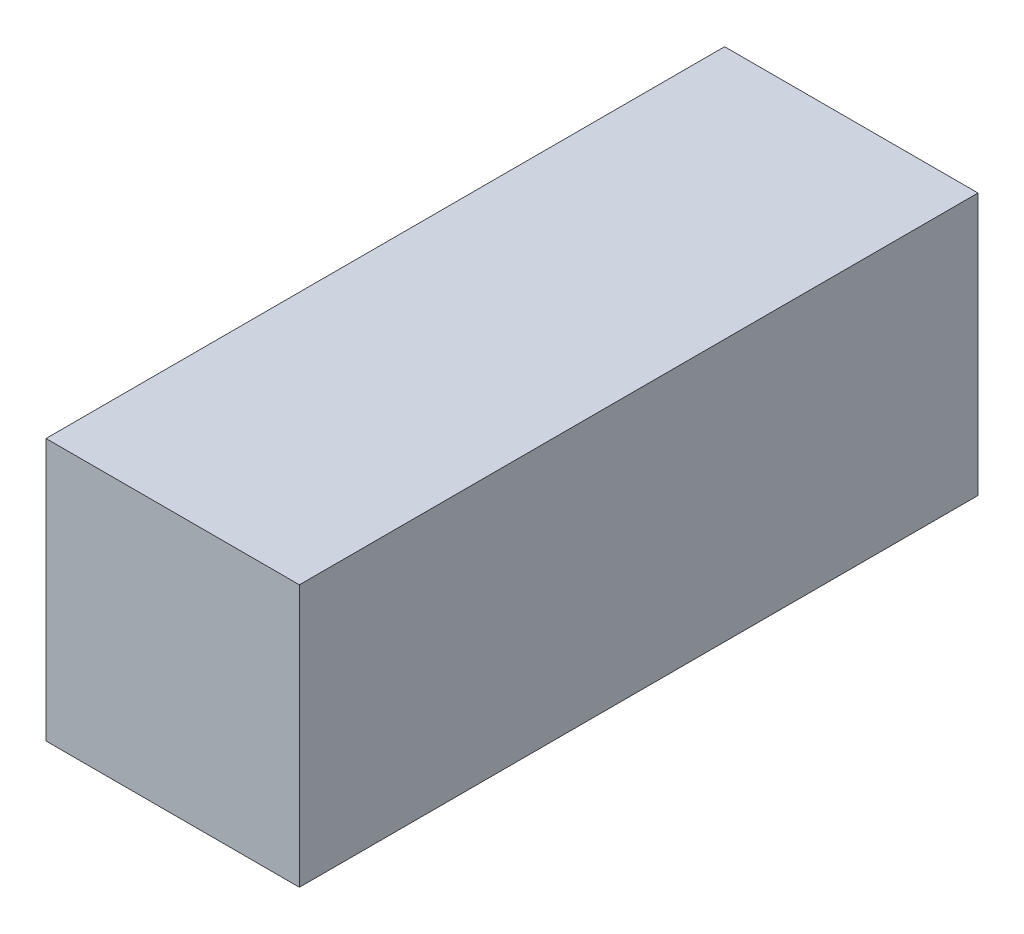
ISO-10303-21;
HEADER;
FILE_DESCRIPTION(('STEP AP214'),'2;1');
FILE_NAME('part.step','',(''),(''),'','','');
FILE_SCHEMA(('AUTOMOTIVE_DESIGN { 1 0 10303 214 1 1 1 1 }'));
ENDSEC;
DATA;
#1=APPLICATION_CONTEXT('core data for automotive mechanical design processes');
#2=APPLICATION_PROTOCOL_DEFINITION('international standard','automotive_design',2000,#1);
#3=PRODUCT_CONTEXT('',#1,'mechanical');
#4=PRODUCT('Part','Part','',(#3));
#5=PRODUCT_RELATED_PRODUCT_CATEGORY('part','',(#4));
#6=PRODUCT_DEFINITION_FORMATION('','',#4);
#7=PRODUCT_DEFINITION_CONTEXT('part definition',#1,'design');
#8=PRODUCT_DEFINITION('design','',#6,#7);
#9=PRODUCT_DEFINITION_SHAPE('','',#8);
#10=(LENGTH_UNIT() NAMED_UNIT(*) SI_UNIT(.MILLI.,.METRE.));
#11=(NAMED_UNIT(*) PLANE_ANGLE_UNIT() SI_UNIT($,.RADIAN.));
#12=(NAMED_UNIT(*) SI_UNIT($,.STERADIAN.) SOLID_ANGLE_UNIT());
#13=UNCERTAINTY_MEASURE_WITH_UNIT(LENGTH_MEASURE(1.E-05),#10,'distance_accuracy_value','');
#14=(GEOMETRIC_REPRESENTATION_CONTEXT(3) GLOBAL_UNCERTAINTY_ASSIGNED_CONTEXT((#13)) GLOBAL_UNIT_ASSIGNED_CONTEXT((#10,
#11,#12)) REPRESENTATION_CONTEXT('',''));
#15=CARTESIAN_POINT('',(0.,0.,0.));
#16=DIRECTION('',(0.,0.,1.));
#17=DIRECTION('',(1.,0.,0.));
#18=AXIS2_PLACEMENT_3D('',#15,#16,#17);
#19=CARTESIAN_POINT('',(-29.5,61.,79.));
#20=DIRECTION('',(1.,0.,0.));
#21=DIRECTION('',(0.,0.,-1.));
#22=AXIS2_PLACEMENT_3D('',#19,#20,#21);
#23=PLANE('',#22);
#24=DIRECTION('',(0.,0.,1.));
#25=VECTOR('',#24,1.);
#26=CARTESIAN_POINT('',(-29.5,0.,79.));
#27=LINE('',#26,#25);
#28=CARTESIAN_POINT('',(-29.5,0.,-79.));
#29=VERTEX_POINT('',#28);
#30=CARTESIAN_POINT('',(-29.5,0.,79.));
#31=VERTEX_POINT('',#30);
#32=EDGE_CURVE('E97',#29,#31,#27,.T.);
#33=ORIENTED_EDGE('',*,*,#32,.T.);
#34=DIRECTION('',(0.,-1.,0.));
#35=VECTOR('',#34,1.);
#36=CARTESIAN_POINT('',(-29.5,61.,79.));
#37=LINE('',#36,#35);
#38=CARTESIAN_POINT('',(-29.5,61.,79.));
#39=VERTEX_POINT('',#38);
#40=EDGE_CURVE('E11',#39,#31,#37,.T.);
#41=ORIENTED_EDGE('',*,*,#40,.F.);
#42=DIRECTION('',(0.,0.,1.));
#43=VECTOR('',#42,1.);
#44=CARTESIAN_POINT('',(-29.5,61.,79.));
#45=LINE('',#44,#43);
#46=CARTESIAN_POINT('',(-29.5,61.,-79.));
#47=VERTEX_POINT('',#46);
#48=EDGE_CURVE('E85',#47,#39,#45,.T.);
#49=ORIENTED_EDGE('',*,*,#48,.F.);
#50=DIRECTION('',(0.,-1.,0.));
#51=VECTOR('',#50,1.);
#52=CARTESIAN_POINT('',(-29.5,61.,-79.));
#53=LINE('',#52,#51);
#54=EDGE_CURVE('E93',#47,#29,#53,.T.);
#55=ORIENTED_EDGE('',*,*,#54,.T.);
#56=EDGE_LOOP('',(#33,#41,#49,#55));
#57=FACE_BOUND('',#56,.T.);
#58=ADVANCED_FACE('F34',(#57),#23,.F.);
#59=CARTESIAN_POINT('',(-29.5,61.,79.));
#60=DIRECTION('',(0.,0.,-1.));
#61=DIRECTION('',(-1.,0.,0.));
#62=AXIS2_PLACEMENT_3D('',#59,#60,#61);
#63=PLANE('',#62);
#64=DIRECTION('',(1.,0.,0.));
#65=VECTOR('',#64,1.);
#66=CARTESIAN_POINT('',(-29.5,0.,79.));
#67=LINE('',#66,#65);
#68=CARTESIAN_POINT('',(29.5,0.,79.));
#69=VERTEX_POINT('',#68);
#70=EDGE_CURVE('E89',#31,#69,#67,.T.);
#71=ORIENTED_EDGE('',*,*,#70,.T.);
#72=DIRECTION('',(0.,-1.,0.));
#73=VECTOR('',#72,1.);
#74=CARTESIAN_POINT('',(29.5,61.,79.));
#75=LINE('',#74,#73);
#76=CARTESIAN_POINT('',(29.5,61.,79.));
#77=VERTEX_POINT('',#76);
#78=EDGE_CURVE('E42',#77,#69,#75,.T.);
#79=ORIENTED_EDGE('',*,*,#78,.F.);
#80=DIRECTION('',(1.,0.,0.));
#81=VECTOR('',#80,1.);
#82=CARTESIAN_POINT('',(-29.5,61.,79.));
#83=LINE('',#82,#81);
#84=EDGE_CURVE('E80',#39,#77,#83,.T.);
#85=ORIENTED_EDGE('',*,*,#84,.F.);
#86=ORIENTED_EDGE('',*,*,#40,.T.);
#87=EDGE_LOOP('',(#71,#79,#85,#86));
#88=FACE_BOUND('',#87,.T.);
#89=ADVANCED_FACE('F88',(#88),#63,.F.);
#90=CARTESIAN_POINT('',(29.5,61.,79.));
#91=DIRECTION('',(-1.,0.,0.));
#92=DIRECTION('',(0.,0.,1.));
#93=AXIS2_PLACEMENT_3D('',#90,#91,#92);
#94=PLANE('',#93);
#95=DIRECTION('',(0.,0.,-1.));
#96=VECTOR('',#95,1.);
#97=CARTESIAN_POINT('',(29.5,0.,79.));
#98=LINE('',#97,#96);
#99=CARTESIAN_POINT('',(29.5,0.,-79.));
#100=VERTEX_POINT('',#99);
#101=EDGE_CURVE('E67',#69,#100,#98,.T.);
#102=ORIENTED_EDGE('',*,*,#101,.T.);
#103=DIRECTION('',(0.,-1.,0.));
#104=VECTOR('',#103,1.);
#105=CARTESIAN_POINT('',(29.5,61.,-79.));
#106=LINE('',#105,#104);
#107=CARTESIAN_POINT('',(29.5,61.,-79.));
#108=VERTEX_POINT('',#107);
#109=EDGE_CURVE('E90',#108,#100,#106,.T.);
#110=ORIENTED_EDGE('',*,*,#109,.F.);
#111=DIRECTION('',(0.,0.,-1.));
#112=VECTOR('',#111,1.);
#113=CARTESIAN_POINT('',(29.5,61.,79.));
#114=LINE('',#113,#112);
#115=EDGE_CURVE('E83',#77,#108,#114,.T.);
#116=ORIENTED_EDGE('',*,*,#115,.F.);
#117=ORIENTED_EDGE('',*,*,#78,.T.);
#118=EDGE_LOOP('',(#102,#110,#116,#117));
#119=FACE_BOUND('',#118,.T.);
#120=ADVANCED_FACE('F91',(#119),#94,.F.);
#121=CARTESIAN_POINT('',(-29.5,61.,-79.));
#122=DIRECTION('',(0.,0.,1.));
#123=DIRECTION('',(1.,0.,0.));
#124=AXIS2_PLACEMENT_3D('',#121,#122,#123);
#125=PLANE('',#124);
#126=DIRECTION('',(-1.,0.,0.));
#127=VECTOR('',#126,1.);
#128=CARTESIAN_POINT('',(-29.5,0.,-79.));
#129=LINE('',#128,#127);
#130=EDGE_CURVE('E73',#100,#29,#129,.T.);
#131=ORIENTED_EDGE('',*,*,#130,.T.);
#132=ORIENTED_EDGE('',*,*,#54,.F.);
#133=DIRECTION('',(-1.,0.,0.));
#134=VECTOR('',#133,1.);
#135=CARTESIAN_POINT('',(-29.5,61.,-79.));
#136=LINE('',#135,#134);
#137=EDGE_CURVE('E50',#108,#47,#136,.T.);
#138=ORIENTED_EDGE('',*,*,#137,.F.);
#139=ORIENTED_EDGE('',*,*,#109,.T.);
#140=EDGE_LOOP('',(#131,#132,#138,#139));
#141=FACE_BOUND('',#140,.T.);
#142=ADVANCED_FACE('F104',(#141),#125,.F.);
#143=CARTESIAN_POINT('',(0.,61.,0.));
#144=DIRECTION('',(0.,-1.,0.));
#145=DIRECTION('',(0.,0.,-1.));
#146=AXIS2_PLACEMENT_3D('',#143,#144,#145);
#147=PLANE('',#146);
#148=ORIENTED_EDGE('',*,*,#48,.T.);
#149=ORIENTED_EDGE('',*,*,#84,.T.);
#150=ORIENTED_EDGE('',*,*,#115,.T.);
#151=ORIENTED_EDGE('',*,*,#137,.T.);
#152=EDGE_LOOP('',(#148,#149,#150,#151));
#153=FACE_BOUND('',#152,.T.);
#154=ADVANCED_FACE('F81',(#153),#147,.F.);
#155=CARTESIAN_POINT('',(0.,0.,0.));
#156=DIRECTION('',(0.,-1.,0.));
#157=DIRECTION('',(0.,0.,-1.));
#158=AXIS2_PLACEMENT_3D('',#155,#156,#157);
#159=PLANE('',#158);
#160=ORIENTED_EDGE('',*,*,#32,.F.);
#161=ORIENTED_EDGE('',*,*,#130,.F.);
#162=ORIENTED_EDGE('',*,*,#101,.F.);
#163=ORIENTED_EDGE('',*,*,#70,.F.);
#164=EDGE_LOOP('',(#160,#161,#162,#163));
#165=FACE_BOUND('',#164,.T.);
#166=ADVANCED_FACE('F107',(#165),#159,.T.);
#167=CLOSED_SHELL('',(#58,#89,#120,#142,#154,#166));
#168=MANIFOLD_SOLID_BREP('B2',#167);
#169=ADVANCED_BREP_SHAPE_REPRESENTATION('',(#18,#168),#14);
#170=SHAPE_DEFINITION_REPRESENTATION(#9,#169);
ENDSEC;
END-ISO-10303-21;
